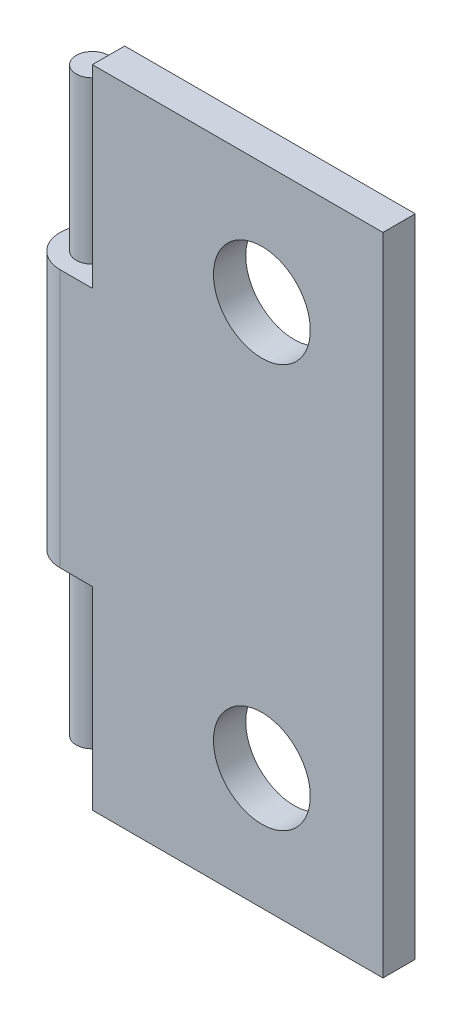
ISO-10303-21;
HEADER;
FILE_DESCRIPTION(('STEP AP214'),'2;1');
FILE_NAME('part.step','',(''),(''),'','','');
FILE_SCHEMA(('AUTOMOTIVE_DESIGN { 1 0 10303 214 1 1 1 1 }'));
ENDSEC;
DATA;
#1=APPLICATION_CONTEXT('core data for automotive mechanical design processes');
#2=APPLICATION_PROTOCOL_DEFINITION('international standard','automotive_design',2000,#1);
#3=PRODUCT_CONTEXT('',#1,'mechanical');
#4=PRODUCT('Part','Part','',(#3));
#5=PRODUCT_RELATED_PRODUCT_CATEGORY('part','',(#4));
#6=PRODUCT_DEFINITION_FORMATION('','',#4);
#7=PRODUCT_DEFINITION_CONTEXT('part definition',#1,'design');
#8=PRODUCT_DEFINITION('design','',#6,#7);
#9=PRODUCT_DEFINITION_SHAPE('','',#8);
#10=(LENGTH_UNIT() NAMED_UNIT(*) SI_UNIT(.MILLI.,.METRE.));
#11=(NAMED_UNIT(*) PLANE_ANGLE_UNIT() SI_UNIT($,.RADIAN.));
#12=(NAMED_UNIT(*) SI_UNIT($,.STERADIAN.) SOLID_ANGLE_UNIT());
#13=UNCERTAINTY_MEASURE_WITH_UNIT(LENGTH_MEASURE(1.E-05),#10,'distance_accuracy_value','');
#14=(GEOMETRIC_REPRESENTATION_CONTEXT(3) GLOBAL_UNCERTAINTY_ASSIGNED_CONTEXT((#13)) GLOBAL_UNIT_ASSIGNED_CONTEXT((#10,
#11,#12)) REPRESENTATION_CONTEXT('',''));
#15=CARTESIAN_POINT('',(0.,0.,0.));
#16=DIRECTION('',(0.,0.,1.));
#17=DIRECTION('',(1.,0.,0.));
#18=AXIS2_PLACEMENT_3D('',#15,#16,#17);
#19=CARTESIAN_POINT('',(-9.99999999999997,40.,-1.));
#20=DIRECTION('',(0.,-1.,0.));
#21=DIRECTION('',(0.,0.,-1.));
#22=AXIS2_PLACEMENT_3D('',#19,#20,#21);
#23=CYLINDRICAL_SURFACE('',#22,2.);
#24=DIRECTION('',(0.,-1.,0.));
#25=VECTOR('',#24,1.);
#26=CARTESIAN_POINT('',(-7.99999999999997,40.,-1.));
#27=LINE('',#26,#25);
#28=CARTESIAN_POINT('',(-7.99999999999997,28.,-1.));
#29=VERTEX_POINT('',#28);
#30=CARTESIAN_POINT('',(-7.99999999999997,12.,-1.));
#31=VERTEX_POINT('',#30);
#32=EDGE_CURVE('E123',#29,#31,#27,.T.);
#33=ORIENTED_EDGE('',*,*,#32,.T.);
#34=CARTESIAN_POINT('',(-9.99999999999997,12.,-1.));
#35=DIRECTION('',(0.,1.,0.));
#36=DIRECTION('',(0.,0.,1.));
#37=AXIS2_PLACEMENT_3D('',#34,#35,#36);
#38=CIRCLE('',#37,2.);
#39=CARTESIAN_POINT('',(-9.99999999999997,12.,1.));
#40=VERTEX_POINT('',#39);
#41=EDGE_CURVE('E110',#31,#40,#38,.T.);
#42=ORIENTED_EDGE('',*,*,#41,.T.);
#43=DIRECTION('',(0.,-1.,0.));
#44=VECTOR('',#43,1.);
#45=CARTESIAN_POINT('',(-9.99999999999997,40.,1.));
#46=LINE('',#45,#44);
#47=CARTESIAN_POINT('',(-9.99999999999997,28.,1.));
#48=VERTEX_POINT('',#47);
#49=EDGE_CURVE('E120',#48,#40,#46,.T.);
#50=ORIENTED_EDGE('',*,*,#49,.F.);
#51=CARTESIAN_POINT('',(-9.99999999999997,28.,-1.));
#52=DIRECTION('',(0.,1.,0.));
#53=DIRECTION('',(0.,0.,1.));
#54=AXIS2_PLACEMENT_3D('',#51,#52,#53);
#55=CIRCLE('',#54,2.);
#56=EDGE_CURVE('E114',#29,#48,#55,.T.);
#57=ORIENTED_EDGE('',*,*,#56,.F.);
#58=EDGE_LOOP('',(#33,#42,#50,#57));
#59=FACE_BOUND('',#58,.T.);
#60=ADVANCED_FACE('F47',(#59),#23,.T.);
#61=CARTESIAN_POINT('',(0.,40.,1.));
#62=DIRECTION('',(0.,0.,-1.));
#63=DIRECTION('',(-1.,0.,0.));
#64=AXIS2_PLACEMENT_3D('',#61,#62,#63);
#65=PLANE('',#64);
#66=CARTESIAN_POINT('',(2.50000000000004,32.5,1.));
#67=DIRECTION('',(0.,0.,-1.));
#68=DIRECTION('',(-1.,0.,0.));
#69=AXIS2_PLACEMENT_3D('',#66,#67,#68);
#70=CIRCLE('',#69,3.);
#71=CARTESIAN_POINT('',(-0.499999999999966,32.5,1.));
#72=VERTEX_POINT('',#71);
#73=EDGE_CURVE('E192',#72,#72,#70,.T.);
#74=ORIENTED_EDGE('',*,*,#73,.T.);
#75=EDGE_LOOP('',(#74));
#76=FACE_BOUND('',#75,.T.);
#77=CARTESIAN_POINT('',(2.50000000000004,7.5,1.));
#78=DIRECTION('',(0.,0.,-1.));
#79=DIRECTION('',(-1.,0.,0.));
#80=AXIS2_PLACEMENT_3D('',#77,#78,#79);
#81=CIRCLE('',#80,3.);
#82=CARTESIAN_POINT('',(-0.499999999999964,7.5,1.));
#83=VERTEX_POINT('',#82);
#84=EDGE_CURVE('E197',#83,#83,#81,.T.);
#85=ORIENTED_EDGE('',*,*,#84,.T.);
#86=EDGE_LOOP('',(#85));
#87=FACE_BOUND('',#86,.T.);
#88=ORIENTED_EDGE('',*,*,#49,.T.);
#89=DIRECTION('',(1.,0.,0.));
#90=VECTOR('',#89,1.);
#91=CARTESIAN_POINT('',(0.,12.,1.));
#92=LINE('',#91,#90);
#93=CARTESIAN_POINT('',(-7.99999999999997,12.,1.));
#94=VERTEX_POINT('',#93);
#95=EDGE_CURVE('E55',#40,#94,#92,.T.);
#96=ORIENTED_EDGE('',*,*,#95,.T.);
#97=DIRECTION('',(0.,-1.,0.));
#98=VECTOR('',#97,1.);
#99=CARTESIAN_POINT('',(-7.99999999999997,40.,1.));
#100=LINE('',#99,#98);
#101=CARTESIAN_POINT('',(-7.99999999999997,0.,1.));
#102=VERTEX_POINT('',#101);
#103=EDGE_CURVE('E140',#94,#102,#100,.T.);
#104=ORIENTED_EDGE('',*,*,#103,.T.);
#105=DIRECTION('',(1.,0.,0.));
#106=VECTOR('',#105,1.);
#107=CARTESIAN_POINT('',(0.,0.,1.));
#108=LINE('',#107,#106);
#109=CARTESIAN_POINT('',(10.,0.,1.));
#110=VERTEX_POINT('',#109);
#111=EDGE_CURVE('E104',#102,#110,#108,.T.);
#112=ORIENTED_EDGE('',*,*,#111,.T.);
#113=DIRECTION('',(0.,-1.,0.));
#114=VECTOR('',#113,1.);
#115=CARTESIAN_POINT('',(10.,40.,1.));
#116=LINE('',#115,#114);
#117=CARTESIAN_POINT('',(10.,40.,1.));
#118=VERTEX_POINT('',#117);
#119=EDGE_CURVE('E95',#118,#110,#116,.T.);
#120=ORIENTED_EDGE('',*,*,#119,.F.);
#121=DIRECTION('',(1.,0.,0.));
#122=VECTOR('',#121,1.);
#123=CARTESIAN_POINT('',(0.,40.,1.));
#124=LINE('',#123,#122);
#125=CARTESIAN_POINT('',(-7.99999999999997,40.,1.));
#126=VERTEX_POINT('',#125);
#127=EDGE_CURVE('E174',#126,#118,#124,.T.);
#128=ORIENTED_EDGE('',*,*,#127,.F.);
#129=DIRECTION('',(0.,1.,0.));
#130=VECTOR('',#129,1.);
#131=CARTESIAN_POINT('',(-7.99999999999997,40.,1.));
#132=LINE('',#131,#130);
#133=CARTESIAN_POINT('',(-7.99999999999997,28.,1.));
#134=VERTEX_POINT('',#133);
#135=EDGE_CURVE('E62',#134,#126,#132,.T.);
#136=ORIENTED_EDGE('',*,*,#135,.F.);
#137=DIRECTION('',(1.,0.,0.));
#138=VECTOR('',#137,1.);
#139=CARTESIAN_POINT('',(0.,28.,1.));
#140=LINE('',#139,#138);
#141=EDGE_CURVE('E130',#48,#134,#140,.T.);
#142=ORIENTED_EDGE('',*,*,#141,.F.);
#143=EDGE_LOOP('',(#88,#96,#104,#112,#120,#128,#136,#142));
#144=FACE_BOUND('',#143,.T.);
#145=ADVANCED_FACE('F137',(#76,#87,#144),#65,.F.);
#146=CARTESIAN_POINT('',(0.,40.,0.));
#147=DIRECTION('',(0.,1.,0.));
#148=DIRECTION('',(0.,0.,1.));
#149=AXIS2_PLACEMENT_3D('',#146,#147,#148);
#150=PLANE('',#149);
#151=DIRECTION('',(1.,0.,0.));
#152=VECTOR('',#151,1.);
#153=CARTESIAN_POINT('',(0.,40.,-1.));
#154=LINE('',#153,#152);
#155=CARTESIAN_POINT('',(-7.99999999999997,40.,-1.));
#156=VERTEX_POINT('',#155);
#157=CARTESIAN_POINT('',(10.,40.,-1.));
#158=VERTEX_POINT('',#157);
#159=EDGE_CURVE('E93',#156,#158,#154,.T.);
#160=ORIENTED_EDGE('',*,*,#159,.F.);
#161=DIRECTION('',(0.,0.,1.));
#162=VECTOR('',#161,1.);
#163=CARTESIAN_POINT('',(-7.99999999999997,40.,0.));
#164=LINE('',#163,#162);
#165=EDGE_CURVE('E128',#156,#126,#164,.T.);
#166=ORIENTED_EDGE('',*,*,#165,.T.);
#167=ORIENTED_EDGE('',*,*,#127,.T.);
#168=DIRECTION('',(0.,0.,-1.));
#169=VECTOR('',#168,1.);
#170=CARTESIAN_POINT('',(10.,40.,0.));
#171=LINE('',#170,#169);
#172=EDGE_CURVE('E71',#118,#158,#171,.T.);
#173=ORIENTED_EDGE('',*,*,#172,.T.);
#174=EDGE_LOOP('',(#160,#166,#167,#173));
#175=FACE_BOUND('',#174,.T.);
#176=ADVANCED_FACE('F176',(#175),#150,.T.);
#177=CARTESIAN_POINT('',(0.,40.,-1.));
#178=DIRECTION('',(0.,0.,-1.));
#179=DIRECTION('',(-1.,0.,0.));
#180=AXIS2_PLACEMENT_3D('',#177,#178,#179);
#181=PLANE('',#180);
#182=CARTESIAN_POINT('',(2.50000000000004,32.5,-1.));
#183=DIRECTION('',(0.,0.,-1.));
#184=DIRECTION('',(-1.,0.,0.));
#185=AXIS2_PLACEMENT_3D('',#182,#183,#184);
#186=CIRCLE('',#185,3.);
#187=CARTESIAN_POINT('',(-0.499999999999966,32.5,-1.));
#188=VERTEX_POINT('',#187);
#189=EDGE_CURVE('E200',#188,#188,#186,.T.);
#190=ORIENTED_EDGE('',*,*,#189,.F.);
#191=EDGE_LOOP('',(#190));
#192=FACE_BOUND('',#191,.T.);
#193=CARTESIAN_POINT('',(2.50000000000004,7.5,-1.));
#194=DIRECTION('',(0.,0.,-1.));
#195=DIRECTION('',(-1.,0.,0.));
#196=AXIS2_PLACEMENT_3D('',#193,#194,#195);
#197=CIRCLE('',#196,3.);
#198=CARTESIAN_POINT('',(-0.499999999999964,7.5,-1.));
#199=VERTEX_POINT('',#198);
#200=EDGE_CURVE('E201',#199,#199,#197,.T.);
#201=ORIENTED_EDGE('',*,*,#200,.F.);
#202=EDGE_LOOP('',(#201));
#203=FACE_BOUND('',#202,.T.);
#204=DIRECTION('',(1.,0.,0.));
#205=VECTOR('',#204,1.);
#206=CARTESIAN_POINT('',(0.,0.,-1.));
#207=LINE('',#206,#205);
#208=CARTESIAN_POINT('',(-7.99999999999997,0.,-1.));
#209=VERTEX_POINT('',#208);
#210=CARTESIAN_POINT('',(10.,0.,-1.));
#211=VERTEX_POINT('',#210);
#212=EDGE_CURVE('E91',#209,#211,#207,.T.);
#213=ORIENTED_EDGE('',*,*,#212,.F.);
#214=DIRECTION('',(0.,-1.,0.));
#215=VECTOR('',#214,1.);
#216=CARTESIAN_POINT('',(-7.99999999999997,40.,-1.));
#217=LINE('',#216,#215);
#218=EDGE_CURVE('E166',#31,#209,#217,.T.);
#219=ORIENTED_EDGE('',*,*,#218,.F.);
#220=ORIENTED_EDGE('',*,*,#32,.F.);
#221=EDGE_CURVE('E124',#156,#29,#27,.T.);
#222=ORIENTED_EDGE('',*,*,#221,.F.);
#223=ORIENTED_EDGE('',*,*,#159,.T.);
#224=DIRECTION('',(0.,-1.,0.));
#225=VECTOR('',#224,1.);
#226=CARTESIAN_POINT('',(10.,40.,-1.));
#227=LINE('',#226,#225);
#228=EDGE_CURVE('E87',#158,#211,#227,.T.);
#229=ORIENTED_EDGE('',*,*,#228,.T.);
#230=EDGE_LOOP('',(#213,#219,#220,#222,#223,#229));
#231=FACE_BOUND('',#230,.T.);
#232=ADVANCED_FACE('F49',(#192,#203,#231),#181,.T.);
#233=CARTESIAN_POINT('',(10.,40.,0.));
#234=DIRECTION('',(-1.,0.,0.));
#235=DIRECTION('',(0.,0.,1.));
#236=AXIS2_PLACEMENT_3D('',#233,#234,#235);
#237=PLANE('',#236);
#238=DIRECTION('',(0.,0.,-1.));
#239=VECTOR('',#238,1.);
#240=CARTESIAN_POINT('',(10.,0.,0.));
#241=LINE('',#240,#239);
#242=EDGE_CURVE('E99',#110,#211,#241,.T.);
#243=ORIENTED_EDGE('',*,*,#242,.T.);
#244=ORIENTED_EDGE('',*,*,#228,.F.);
#245=ORIENTED_EDGE('',*,*,#172,.F.);
#246=ORIENTED_EDGE('',*,*,#119,.T.);
#247=EDGE_LOOP('',(#243,#244,#245,#246));
#248=FACE_BOUND('',#247,.T.);
#249=ADVANCED_FACE('F100',(#248),#237,.F.);
#250=CARTESIAN_POINT('',(0.,0.,0.));
#251=DIRECTION('',(0.,1.,0.));
#252=DIRECTION('',(0.,0.,1.));
#253=AXIS2_PLACEMENT_3D('',#250,#251,#252);
#254=PLANE('',#253);
#255=ORIENTED_EDGE('',*,*,#111,.F.);
#256=DIRECTION('',(0.,0.,-1.));
#257=VECTOR('',#256,1.);
#258=CARTESIAN_POINT('',(-7.99999999999997,0.,0.));
#259=LINE('',#258,#257);
#260=EDGE_CURVE('E109',#102,#209,#259,.T.);
#261=ORIENTED_EDGE('',*,*,#260,.T.);
#262=ORIENTED_EDGE('',*,*,#212,.T.);
#263=ORIENTED_EDGE('',*,*,#242,.F.);
#264=EDGE_LOOP('',(#255,#261,#262,#263));
#265=FACE_BOUND('',#264,.T.);
#266=ADVANCED_FACE('F107',(#265),#254,.F.);
#267=CARTESIAN_POINT('',(-7.99999999999997,12.,-41.));
#268=DIRECTION('',(0.,1.,0.));
#269=DIRECTION('',(0.,0.,1.));
#270=AXIS2_PLACEMENT_3D('',#267,#268,#269);
#271=PLANE('',#270);
#272=CARTESIAN_POINT('',(-9.99999999999997,12.,-1.));
#273=DIRECTION('',(0.,1.,0.));
#274=DIRECTION('',(0.,0.,1.));
#275=AXIS2_PLACEMENT_3D('',#272,#273,#274);
#276=CIRCLE('',#275,1.);
#277=CARTESIAN_POINT('',(-9.99999999999997,12.,0.));
#278=VERTEX_POINT('',#277);
#279=EDGE_CURVE('E11',#278,#278,#276,.F.);
#280=ORIENTED_EDGE('',*,*,#279,.F.);
#281=EDGE_LOOP('',(#280));
#282=FACE_BOUND('',#281,.T.);
#283=DIRECTION('',(0.,0.,1.));
#284=VECTOR('',#283,1.);
#285=CARTESIAN_POINT('',(-7.99999999999997,12.,-41.));
#286=LINE('',#285,#284);
#287=EDGE_CURVE('E150',#31,#94,#286,.T.);
#288=ORIENTED_EDGE('',*,*,#287,.T.);
#289=ORIENTED_EDGE('',*,*,#95,.F.);
#290=ORIENTED_EDGE('',*,*,#41,.F.);
#291=EDGE_LOOP('',(#288,#289,#290));
#292=FACE_BOUND('',#291,.T.);
#293=ADVANCED_FACE('F148',(#282,#292),#271,.F.);
#294=CARTESIAN_POINT('',(-7.99999999999997,0.,-41.));
#295=DIRECTION('',(1.,0.,0.));
#296=DIRECTION('',(0.,0.,-1.));
#297=AXIS2_PLACEMENT_3D('',#294,#295,#296);
#298=PLANE('',#297);
#299=ORIENTED_EDGE('',*,*,#218,.T.);
#300=ORIENTED_EDGE('',*,*,#260,.F.);
#301=ORIENTED_EDGE('',*,*,#103,.F.);
#302=ORIENTED_EDGE('',*,*,#287,.F.);
#303=EDGE_LOOP('',(#299,#300,#301,#302));
#304=FACE_BOUND('',#303,.T.);
#305=ADVANCED_FACE('F165',(#304),#298,.F.);
#306=CARTESIAN_POINT('',(-7.99999999999997,28.,-41.));
#307=DIRECTION('',(0.,1.,0.));
#308=DIRECTION('',(0.,0.,1.));
#309=AXIS2_PLACEMENT_3D('',#306,#307,#308);
#310=PLANE('',#309);
#311=CARTESIAN_POINT('',(-9.99999999999997,28.,-1.));
#312=DIRECTION('',(0.,1.,0.));
#313=DIRECTION('',(0.,0.,1.));
#314=AXIS2_PLACEMENT_3D('',#311,#312,#313);
#315=CIRCLE('',#314,1.);
#316=CARTESIAN_POINT('',(-9.99999999999997,28.,0.));
#317=VERTEX_POINT('',#316);
#318=EDGE_CURVE('E189',#317,#317,#315,.T.);
#319=ORIENTED_EDGE('',*,*,#318,.F.);
#320=EDGE_LOOP('',(#319));
#321=FACE_BOUND('',#320,.T.);
#322=ORIENTED_EDGE('',*,*,#56,.T.);
#323=ORIENTED_EDGE('',*,*,#141,.T.);
#324=DIRECTION('',(0.,0.,1.));
#325=VECTOR('',#324,1.);
#326=CARTESIAN_POINT('',(-7.99999999999997,28.,-41.));
#327=LINE('',#326,#325);
#328=EDGE_CURVE('E181',#29,#134,#327,.T.);
#329=ORIENTED_EDGE('',*,*,#328,.F.);
#330=EDGE_LOOP('',(#322,#323,#329));
#331=FACE_BOUND('',#330,.T.);
#332=ADVANCED_FACE('F182',(#321,#331),#310,.T.);
#333=CARTESIAN_POINT('',(-7.99999999999997,40.,-41.));
#334=DIRECTION('',(-1.,0.,0.));
#335=DIRECTION('',(0.,-1.,0.));
#336=AXIS2_PLACEMENT_3D('',#333,#334,#335);
#337=PLANE('',#336);
#338=ORIENTED_EDGE('',*,*,#221,.T.);
#339=ORIENTED_EDGE('',*,*,#328,.T.);
#340=ORIENTED_EDGE('',*,*,#135,.T.);
#341=ORIENTED_EDGE('',*,*,#165,.F.);
#342=EDGE_LOOP('',(#338,#339,#340,#341));
#343=FACE_BOUND('',#342,.T.);
#344=ADVANCED_FACE('F180',(#343),#337,.T.);
#345=CARTESIAN_POINT('',(-9.99999999999997,2.,-1.));
#346=DIRECTION('',(0.,1.,0.));
#347=DIRECTION('',(0.,0.,1.));
#348=AXIS2_PLACEMENT_3D('',#345,#346,#347);
#349=CYLINDRICAL_SURFACE('',#348,1.);
#350=CARTESIAN_POINT('',(-9.99999999999997,2.,-1.));
#351=DIRECTION('',(0.,-1.,0.));
#352=DIRECTION('',(0.,0.,-1.));
#353=AXIS2_PLACEMENT_3D('',#350,#351,#352);
#354=CIRCLE('',#353,1.);
#355=CARTESIAN_POINT('',(-9.99999999999997,2.,-2.));
#356=VERTEX_POINT('',#355);
#357=EDGE_CURVE('E183',#356,#356,#354,.T.);
#358=ORIENTED_EDGE('',*,*,#357,.F.);
#359=EDGE_LOOP('',(#358));
#360=FACE_BOUND('',#359,.T.);
#361=ORIENTED_EDGE('',*,*,#279,.T.);
#362=EDGE_LOOP('',(#361));
#363=FACE_BOUND('',#362,.T.);
#364=ADVANCED_FACE('F237',(#360,#363),#349,.T.);
#365=CARTESIAN_POINT('',(0.,2.,0.));
#366=DIRECTION('',(0.,-1.,0.));
#367=DIRECTION('',(0.,0.,-1.));
#368=AXIS2_PLACEMENT_3D('',#365,#366,#367);
#369=PLANE('',#368);
#370=ORIENTED_EDGE('',*,*,#357,.T.);
#371=EDGE_LOOP('',(#370));
#372=FACE_BOUND('',#371,.T.);
#373=ADVANCED_FACE('F248',(#372),#369,.T.);
#374=CARTESIAN_POINT('',(-9.99999999999997,38.,-1.));
#375=DIRECTION('',(0.,-1.,0.));
#376=DIRECTION('',(0.,0.,-1.));
#377=AXIS2_PLACEMENT_3D('',#374,#375,#376);
#378=CYLINDRICAL_SURFACE('',#377,1.);
#379=CARTESIAN_POINT('',(-9.99999999999997,38.,-1.));
#380=DIRECTION('',(0.,1.,0.));
#381=DIRECTION('',(0.,0.,1.));
#382=AXIS2_PLACEMENT_3D('',#379,#380,#381);
#383=CIRCLE('',#382,1.);
#384=CARTESIAN_POINT('',(-9.99999999999997,38.,0.));
#385=VERTEX_POINT('',#384);
#386=EDGE_CURVE('E186',#385,#385,#383,.T.);
#387=ORIENTED_EDGE('',*,*,#386,.F.);
#388=EDGE_LOOP('',(#387));
#389=FACE_BOUND('',#388,.T.);
#390=ORIENTED_EDGE('',*,*,#318,.T.);
#391=EDGE_LOOP('',(#390));
#392=FACE_BOUND('',#391,.T.);
#393=ADVANCED_FACE('F252',(#389,#392),#378,.T.);
#394=CARTESIAN_POINT('',(0.,38.,0.));
#395=DIRECTION('',(0.,1.,0.));
#396=DIRECTION('',(0.,0.,1.));
#397=AXIS2_PLACEMENT_3D('',#394,#395,#396);
#398=PLANE('',#397);
#399=ORIENTED_EDGE('',*,*,#386,.T.);
#400=EDGE_LOOP('',(#399));
#401=FACE_BOUND('',#400,.T.);
#402=ADVANCED_FACE('F217',(#401),#398,.T.);
#403=CARTESIAN_POINT('',(2.50000000000004,7.5,9.));
#404=DIRECTION('',(0.,0.,-1.));
#405=DIRECTION('',(-1.,0.,0.));
#406=AXIS2_PLACEMENT_3D('',#403,#404,#405);
#407=CYLINDRICAL_SURFACE('',#406,3.);
#408=ORIENTED_EDGE('',*,*,#200,.T.);
#409=EDGE_LOOP('',(#408));
#410=FACE_BOUND('',#409,.T.);
#411=ORIENTED_EDGE('',*,*,#84,.F.);
#412=EDGE_LOOP('',(#411));
#413=FACE_BOUND('',#412,.T.);
#414=ADVANCED_FACE('F214',(#410,#413),#407,.F.);
#415=CARTESIAN_POINT('',(2.50000000000004,32.5,9.));
#416=DIRECTION('',(0.,0.,-1.));
#417=DIRECTION('',(-1.,0.,0.));
#418=AXIS2_PLACEMENT_3D('',#415,#416,#417);
#419=CYLINDRICAL_SURFACE('',#418,3.);
#420=ORIENTED_EDGE('',*,*,#189,.T.);
#421=EDGE_LOOP('',(#420));
#422=FACE_BOUND('',#421,.T.);
#423=ORIENTED_EDGE('',*,*,#73,.F.);
#424=EDGE_LOOP('',(#423));
#425=FACE_BOUND('',#424,.T.);
#426=ADVANCED_FACE('F207',(#422,#425),#419,.F.);
#427=CLOSED_SHELL('',(#60,#145,#176,#232,#249,#266,#293,#305,#332,#344,#364,#373,#393,#402,#414,#426));
#428=MANIFOLD_SOLID_BREP('B2',#427);
#429=ADVANCED_BREP_SHAPE_REPRESENTATION('',(#18,#428),#14);
#430=SHAPE_DEFINITION_REPRESENTATION(#9,#429);
ENDSEC;
END-ISO-10303-21;
